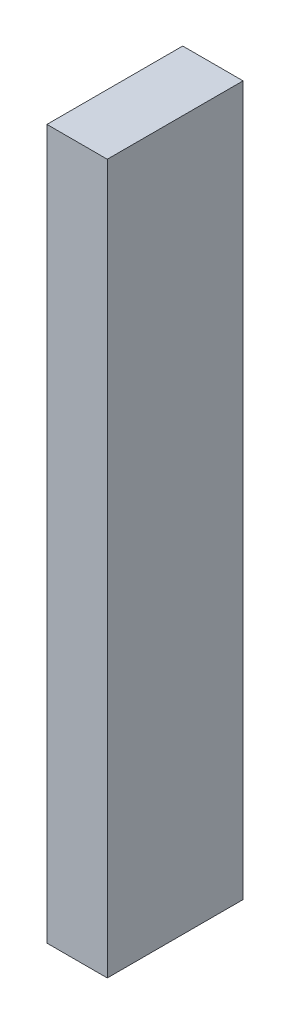
ISO-10303-21;
HEADER;
FILE_DESCRIPTION(('STEP AP214'),'2;1');
FILE_NAME('part.step','',(''),(''),'','','');
FILE_SCHEMA(('AUTOMOTIVE_DESIGN { 1 0 10303 214 1 1 1 1 }'));
ENDSEC;
DATA;
#1=APPLICATION_CONTEXT('core data for automotive mechanical design processes');
#2=APPLICATION_PROTOCOL_DEFINITION('international standard','automotive_design',2000,#1);
#3=PRODUCT_CONTEXT('',#1,'mechanical');
#4=PRODUCT('Part','Part','',(#3));
#5=PRODUCT_RELATED_PRODUCT_CATEGORY('part','',(#4));
#6=PRODUCT_DEFINITION_FORMATION('','',#4);
#7=PRODUCT_DEFINITION_CONTEXT('part definition',#1,'design');
#8=PRODUCT_DEFINITION('design','',#6,#7);
#9=PRODUCT_DEFINITION_SHAPE('','',#8);
#10=(LENGTH_UNIT() NAMED_UNIT(*) SI_UNIT(.MILLI.,.METRE.));
#11=(NAMED_UNIT(*) PLANE_ANGLE_UNIT() SI_UNIT($,.RADIAN.));
#12=(NAMED_UNIT(*) SI_UNIT($,.STERADIAN.) SOLID_ANGLE_UNIT());
#13=UNCERTAINTY_MEASURE_WITH_UNIT(LENGTH_MEASURE(1.E-05),#10,'distance_accuracy_value','');
#14=(GEOMETRIC_REPRESENTATION_CONTEXT(3) GLOBAL_UNCERTAINTY_ASSIGNED_CONTEXT((#13)) GLOBAL_UNIT_ASSIGNED_CONTEXT((#10,
#11,#12)) REPRESENTATION_CONTEXT('',''));
#15=CARTESIAN_POINT('',(0.,0.,0.));
#16=DIRECTION('',(0.,0.,1.));
#17=DIRECTION('',(1.,0.,0.));
#18=AXIS2_PLACEMENT_3D('',#15,#16,#17);
#19=CARTESIAN_POINT('',(-126.488766336441,-460.375,178.339450471399));
#20=DIRECTION('',(1.,0.,0.));
#21=DIRECTION('',(0.,0.,-1.));
#22=AXIS2_PLACEMENT_3D('',#19,#20,#21);
#23=PLANE('',#22);
#24=DIRECTION('',(0.,-1.,0.));
#25=VECTOR('',#24,1.);
#26=CARTESIAN_POINT('',(-126.488766336441,-460.375,28.575));
#27=LINE('',#26,#25);
#28=CARTESIAN_POINT('',(-126.488766336441,-311.15,28.575));
#29=VERTEX_POINT('',#28);
#30=CARTESIAN_POINT('',(-126.488766336441,-460.375,28.575));
#31=VERTEX_POINT('',#30);
#32=EDGE_CURVE('E117',#29,#31,#27,.T.);
#33=ORIENTED_EDGE('',*,*,#32,.F.);
#34=DIRECTION('',(0.,0.,-1.));
#35=VECTOR('',#34,1.);
#36=CARTESIAN_POINT('',(-126.488766336441,-311.15,178.339450471399));
#37=LINE('',#36,#35);
#38=CARTESIAN_POINT('',(-126.488766336441,-311.15,0.));
#39=VERTEX_POINT('',#38);
#40=EDGE_CURVE('E52',#29,#39,#37,.T.);
#41=ORIENTED_EDGE('',*,*,#40,.T.);
#42=DIRECTION('',(0.,-1.,0.));
#43=VECTOR('',#42,1.);
#44=CARTESIAN_POINT('',(-126.488766336441,-460.375,0.));
#45=LINE('',#44,#43);
#46=CARTESIAN_POINT('',(-126.488766336441,-460.375,0.));
#47=VERTEX_POINT('',#46);
#48=EDGE_CURVE('E113',#39,#47,#45,.T.);
#49=ORIENTED_EDGE('',*,*,#48,.T.);
#50=DIRECTION('',(0.,0.,-1.));
#51=VECTOR('',#50,1.);
#52=CARTESIAN_POINT('',(-126.488766336441,-460.375,178.339450471399));
#53=LINE('',#52,#51);
#54=EDGE_CURVE('E75',#31,#47,#53,.T.);
#55=ORIENTED_EDGE('',*,*,#54,.F.);
#56=EDGE_LOOP('',(#33,#41,#49,#55));
#57=FACE_BOUND('',#56,.T.);
#58=ADVANCED_FACE('F35',(#57),#23,.F.);
#59=CARTESIAN_POINT('',(-126.488766336441,-460.375,178.339450471399));
#60=DIRECTION('',(0.,1.,0.));
#61=DIRECTION('',(0.,0.,1.));
#62=AXIS2_PLACEMENT_3D('',#59,#60,#61);
#63=PLANE('',#62);
#64=DIRECTION('',(1.,0.,0.));
#65=VECTOR('',#64,1.);
#66=CARTESIAN_POINT('',(-126.488766336441,-460.375,28.575));
#67=LINE('',#66,#65);
#68=CARTESIAN_POINT('',(-113.788766336441,-460.375,28.575));
#69=VERTEX_POINT('',#68);
#70=EDGE_CURVE('E44',#31,#69,#67,.T.);
#71=ORIENTED_EDGE('',*,*,#70,.F.);
#72=ORIENTED_EDGE('',*,*,#54,.T.);
#73=DIRECTION('',(1.,0.,0.));
#74=VECTOR('',#73,1.);
#75=CARTESIAN_POINT('',(-126.488766336441,-460.375,0.));
#76=LINE('',#75,#74);
#77=CARTESIAN_POINT('',(-113.788766336441,-460.375,0.));
#78=VERTEX_POINT('',#77);
#79=EDGE_CURVE('E111',#47,#78,#76,.T.);
#80=ORIENTED_EDGE('',*,*,#79,.T.);
#81=DIRECTION('',(0.,0.,-1.));
#82=VECTOR('',#81,1.);
#83=CARTESIAN_POINT('',(-113.788766336441,-460.375,178.339450471399));
#84=LINE('',#83,#82);
#85=EDGE_CURVE('E110',#69,#78,#84,.T.);
#86=ORIENTED_EDGE('',*,*,#85,.F.);
#87=EDGE_LOOP('',(#71,#72,#80,#86));
#88=FACE_BOUND('',#87,.T.);
#89=ADVANCED_FACE('F146',(#88),#63,.F.);
#90=CARTESIAN_POINT('',(-113.788766336441,-460.375,178.339450471399));
#91=DIRECTION('',(-1.,0.,0.));
#92=DIRECTION('',(0.,0.,1.));
#93=AXIS2_PLACEMENT_3D('',#90,#91,#92);
#94=PLANE('',#93);
#95=DIRECTION('',(0.,1.,0.));
#96=VECTOR('',#95,1.);
#97=CARTESIAN_POINT('',(-113.788766336441,-460.375,28.575));
#98=LINE('',#97,#96);
#99=CARTESIAN_POINT('',(-113.788766336441,-311.15,28.575));
#100=VERTEX_POINT('',#99);
#101=EDGE_CURVE('E11',#69,#100,#98,.T.);
#102=ORIENTED_EDGE('',*,*,#101,.F.);
#103=ORIENTED_EDGE('',*,*,#85,.T.);
#104=DIRECTION('',(0.,1.,0.));
#105=VECTOR('',#104,1.);
#106=CARTESIAN_POINT('',(-113.788766336441,-460.375,0.));
#107=LINE('',#106,#105);
#108=CARTESIAN_POINT('',(-113.788766336441,-311.15,0.));
#109=VERTEX_POINT('',#108);
#110=EDGE_CURVE('E108',#78,#109,#107,.T.);
#111=ORIENTED_EDGE('',*,*,#110,.T.);
#112=DIRECTION('',(0.,0.,-1.));
#113=VECTOR('',#112,1.);
#114=CARTESIAN_POINT('',(-113.788766336441,-311.15,178.339450471399));
#115=LINE('',#114,#113);
#116=EDGE_CURVE('E58',#100,#109,#115,.T.);
#117=ORIENTED_EDGE('',*,*,#116,.F.);
#118=EDGE_LOOP('',(#102,#103,#111,#117));
#119=FACE_BOUND('',#118,.T.);
#120=ADVANCED_FACE('F141',(#119),#94,.F.);
#121=CARTESIAN_POINT('',(-126.488766336441,-311.15,178.339450471399));
#122=DIRECTION('',(0.,-1.,0.));
#123=DIRECTION('',(0.,0.,-1.));
#124=AXIS2_PLACEMENT_3D('',#121,#122,#123);
#125=PLANE('',#124);
#126=DIRECTION('',(-1.,0.,0.));
#127=VECTOR('',#126,1.);
#128=CARTESIAN_POINT('',(-126.488766336441,-311.15,28.575));
#129=LINE('',#128,#127);
#130=EDGE_CURVE('E107',#100,#29,#129,.T.);
#131=ORIENTED_EDGE('',*,*,#130,.F.);
#132=ORIENTED_EDGE('',*,*,#116,.T.);
#133=DIRECTION('',(-1.,0.,0.));
#134=VECTOR('',#133,1.);
#135=CARTESIAN_POINT('',(-126.488766336441,-311.15,0.));
#136=LINE('',#135,#134);
#137=EDGE_CURVE('E105',#109,#39,#136,.T.);
#138=ORIENTED_EDGE('',*,*,#137,.T.);
#139=ORIENTED_EDGE('',*,*,#40,.F.);
#140=EDGE_LOOP('',(#131,#132,#138,#139));
#141=FACE_BOUND('',#140,.T.);
#142=ADVANCED_FACE('F133',(#141),#125,.F.);
#143=CARTESIAN_POINT('',(0.,0.,0.));
#144=DIRECTION('',(0.,0.,-1.));
#145=DIRECTION('',(-1.,0.,0.));
#146=AXIS2_PLACEMENT_3D('',#143,#144,#145);
#147=PLANE('',#146);
#148=CARTESIAN_POINT('',(-120.138766336441,-330.2,0.));
#149=DIRECTION('',(0.,0.,-1.));
#150=DIRECTION('',(-1.,0.,0.));
#151=AXIS2_PLACEMENT_3D('',#148,#149,#150);
#152=CIRCLE('',#151,1.58750000000001);
#153=CARTESIAN_POINT('',(-121.726266336441,-330.2,0.));
#154=VERTEX_POINT('',#153);
#155=EDGE_CURVE('E39',#154,#154,#152,.T.);
#156=ORIENTED_EDGE('',*,*,#155,.F.);
#157=EDGE_LOOP('',(#156));
#158=FACE_BOUND('',#157,.T.);
#159=CARTESIAN_POINT('',(-120.138766336441,-444.5,0.));
#160=DIRECTION('',(0.,0.,-1.));
#161=DIRECTION('',(-1.,0.,0.));
#162=AXIS2_PLACEMENT_3D('',#159,#160,#161);
#163=CIRCLE('',#162,1.58750000000001);
#164=CARTESIAN_POINT('',(-121.726266336441,-444.5,0.));
#165=VERTEX_POINT('',#164);
#166=EDGE_CURVE('E104',#165,#165,#163,.T.);
#167=ORIENTED_EDGE('',*,*,#166,.F.);
#168=EDGE_LOOP('',(#167));
#169=FACE_BOUND('',#168,.T.);
#170=ORIENTED_EDGE('',*,*,#48,.F.);
#171=ORIENTED_EDGE('',*,*,#137,.F.);
#172=ORIENTED_EDGE('',*,*,#110,.F.);
#173=ORIENTED_EDGE('',*,*,#79,.F.);
#174=EDGE_LOOP('',(#170,#171,#172,#173));
#175=FACE_BOUND('',#174,.T.);
#176=ADVANCED_FACE('F130',(#158,#169,#175),#147,.T.);
#177=CARTESIAN_POINT('',(0.,0.,28.575));
#178=DIRECTION('',(0.,0.,1.));
#179=DIRECTION('',(1.,0.,0.));
#180=AXIS2_PLACEMENT_3D('',#177,#178,#179);
#181=PLANE('',#180);
#182=ORIENTED_EDGE('',*,*,#130,.T.);
#183=ORIENTED_EDGE('',*,*,#32,.T.);
#184=ORIENTED_EDGE('',*,*,#70,.T.);
#185=ORIENTED_EDGE('',*,*,#101,.T.);
#186=EDGE_LOOP('',(#182,#183,#184,#185));
#187=FACE_BOUND('',#186,.T.);
#188=ADVANCED_FACE('F37',(#187),#181,.T.);
#189=CARTESIAN_POINT('',(-120.138766336441,-444.5,12.7));
#190=DIRECTION('',(0.,0.,-1.));
#191=DIRECTION('',(-1.,0.,0.));
#192=AXIS2_PLACEMENT_3D('',#189,#190,#191);
#193=CONICAL_SURFACE('',#192,1.58750000000001,1.02974425867666);
#194=CARTESIAN_POINT('',(-120.138766336441,-444.5,13.6538662327062));
#195=VERTEX_POINT('',#194);
#196=VERTEX_LOOP('',#195);
#197=FACE_BOUND('',#196,.T.);
#198=CARTESIAN_POINT('',(-120.138766336441,-444.5,12.7));
#199=DIRECTION('',(0.,0.,-1.));
#200=DIRECTION('',(-1.,0.,0.));
#201=AXIS2_PLACEMENT_3D('',#198,#199,#200);
#202=CIRCLE('',#201,1.58750000000001);
#203=CARTESIAN_POINT('',(-121.726266336441,-444.5,12.7));
#204=VERTEX_POINT('',#203);
#205=EDGE_CURVE('E100',#204,#204,#202,.T.);
#206=ORIENTED_EDGE('',*,*,#205,.T.);
#207=EDGE_LOOP('',(#206));
#208=FACE_BOUND('',#207,.T.);
#209=ADVANCED_FACE('F174',(#197,#208),#193,.F.);
#210=CARTESIAN_POINT('',(-120.138766336441,-444.5,-25.4));
#211=DIRECTION('',(0.,0.,-1.));
#212=DIRECTION('',(-1.,0.,0.));
#213=AXIS2_PLACEMENT_3D('',#210,#211,#212);
#214=CYLINDRICAL_SURFACE('',#213,1.58750000000001);
#215=ORIENTED_EDGE('',*,*,#166,.T.);
#216=EDGE_LOOP('',(#215));
#217=FACE_BOUND('',#216,.T.);
#218=ORIENTED_EDGE('',*,*,#205,.F.);
#219=EDGE_LOOP('',(#218));
#220=FACE_BOUND('',#219,.T.);
#221=ADVANCED_FACE('F92',(#217,#220),#214,.F.);
#222=CARTESIAN_POINT('',(-120.138766336441,-330.2,12.7));
#223=DIRECTION('',(0.,0.,-1.));
#224=DIRECTION('',(-1.,0.,0.));
#225=AXIS2_PLACEMENT_3D('',#222,#223,#224);
#226=CONICAL_SURFACE('',#225,1.58750000000001,1.02974425867666);
#227=CARTESIAN_POINT('',(-120.138766336441,-330.2,13.6538662327062));
#228=VERTEX_POINT('',#227);
#229=VERTEX_LOOP('',#228);
#230=FACE_BOUND('',#229,.T.);
#231=CARTESIAN_POINT('',(-120.138766336441,-330.2,12.7));
#232=DIRECTION('',(0.,0.,-1.));
#233=DIRECTION('',(-1.,0.,0.));
#234=AXIS2_PLACEMENT_3D('',#231,#232,#233);
#235=CIRCLE('',#234,1.58750000000001);
#236=CARTESIAN_POINT('',(-121.726266336441,-330.2,12.7));
#237=VERTEX_POINT('',#236);
#238=EDGE_CURVE('E96',#237,#237,#235,.T.);
#239=ORIENTED_EDGE('',*,*,#238,.T.);
#240=EDGE_LOOP('',(#239));
#241=FACE_BOUND('',#240,.T.);
#242=ADVANCED_FACE('F88',(#230,#241),#226,.F.);
#243=CARTESIAN_POINT('',(-120.138766336441,-330.2,-25.4));
#244=DIRECTION('',(0.,0.,-1.));
#245=DIRECTION('',(-1.,0.,0.));
#246=AXIS2_PLACEMENT_3D('',#243,#244,#245);
#247=CYLINDRICAL_SURFACE('',#246,1.58750000000001);
#248=ORIENTED_EDGE('',*,*,#155,.T.);
#249=EDGE_LOOP('',(#248));
#250=FACE_BOUND('',#249,.T.);
#251=ORIENTED_EDGE('',*,*,#238,.F.);
#252=EDGE_LOOP('',(#251));
#253=FACE_BOUND('',#252,.T.);
#254=ADVANCED_FACE('F91',(#250,#253),#247,.F.);
#255=CLOSED_SHELL('',(#58,#89,#120,#142,#176,#188,#209,#221,#242,#254));
#256=MANIFOLD_SOLID_BREP('B2',#255);
#257=ADVANCED_BREP_SHAPE_REPRESENTATION('',(#18,#256),#14);
#258=SHAPE_DEFINITION_REPRESENTATION(#9,#257);
ENDSEC;
END-ISO-10303-21;
